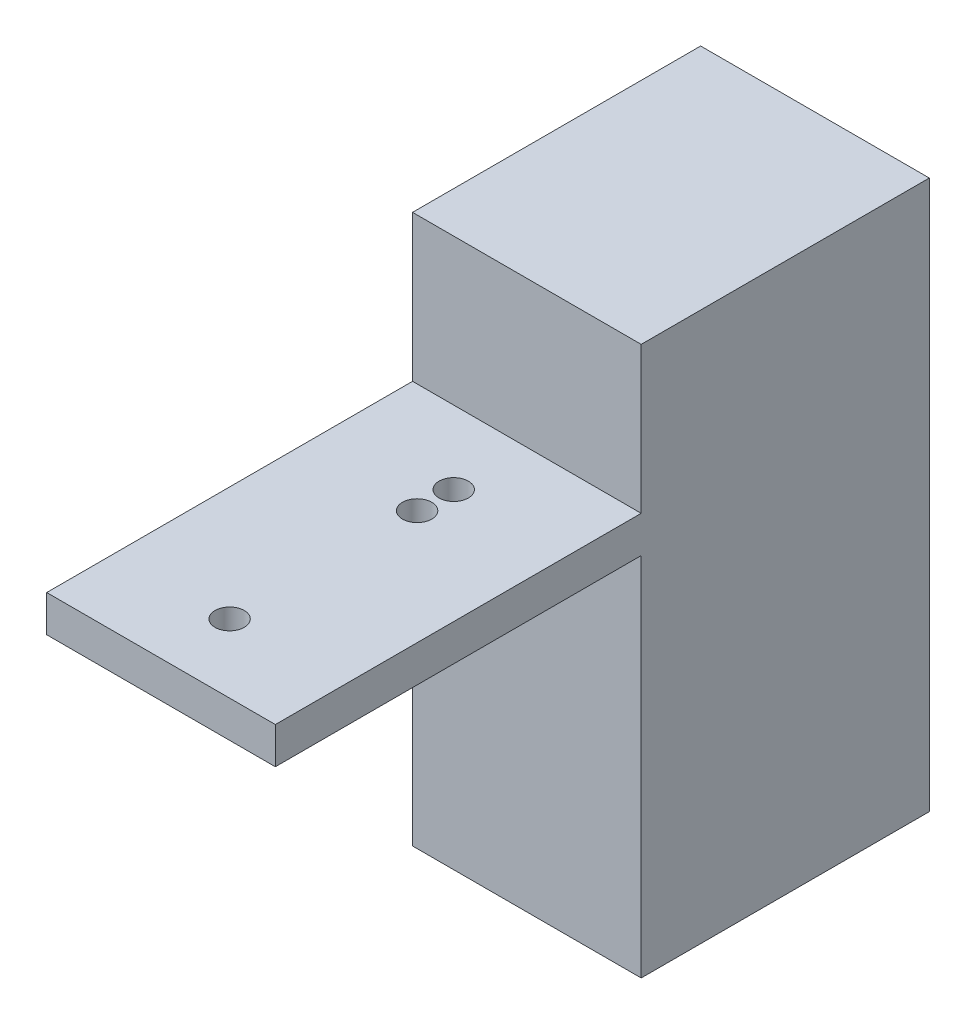
ISO-10303-21;
HEADER;
FILE_DESCRIPTION(('STEP AP214'),'2;1');
FILE_NAME('part.step','',(''),(''),'','','');
FILE_SCHEMA(('AUTOMOTIVE_DESIGN { 1 0 10303 214 1 1 1 1 }'));
ENDSEC;
DATA;
#1=APPLICATION_CONTEXT('core data for automotive mechanical design processes');
#2=APPLICATION_PROTOCOL_DEFINITION('international standard','automotive_design',2000,#1);
#3=PRODUCT_CONTEXT('',#1,'mechanical');
#4=PRODUCT('Part','Part','',(#3));
#5=PRODUCT_RELATED_PRODUCT_CATEGORY('part','',(#4));
#6=PRODUCT_DEFINITION_FORMATION('','',#4);
#7=PRODUCT_DEFINITION_CONTEXT('part definition',#1,'design');
#8=PRODUCT_DEFINITION('design','',#6,#7);
#9=PRODUCT_DEFINITION_SHAPE('','',#8);
#10=(LENGTH_UNIT() NAMED_UNIT(*) SI_UNIT(.MILLI.,.METRE.));
#11=(NAMED_UNIT(*) PLANE_ANGLE_UNIT() SI_UNIT($,.RADIAN.));
#12=(NAMED_UNIT(*) SI_UNIT($,.STERADIAN.) SOLID_ANGLE_UNIT());
#13=UNCERTAINTY_MEASURE_WITH_UNIT(LENGTH_MEASURE(1.E-05),#10,'distance_accuracy_value','');
#14=(GEOMETRIC_REPRESENTATION_CONTEXT(3) GLOBAL_UNCERTAINTY_ASSIGNED_CONTEXT((#13)) GLOBAL_UNIT_ASSIGNED_CONTEXT((#10,
#11,#12)) REPRESENTATION_CONTEXT('',''));
#15=CARTESIAN_POINT('',(0.,0.,0.));
#16=DIRECTION('',(0.,0.,1.));
#17=DIRECTION('',(1.,0.,0.));
#18=AXIS2_PLACEMENT_3D('',#15,#16,#17);
#19=CARTESIAN_POINT('',(12.5,0.,-31.5));
#20=DIRECTION('',(0.,0.,-1.));
#21=DIRECTION('',(0.,1.,0.));
#22=AXIS2_PLACEMENT_3D('',#19,#20,#21);
#23=PLANE('',#22);
#24=CARTESIAN_POINT('',(5.,-4.00000000000001,-31.5));
#25=DIRECTION('',(0.,0.,-1.));
#26=DIRECTION('',(0.,1.,0.));
#27=AXIS2_PLACEMENT_3D('',#24,#25,#26);
#28=CIRCLE('',#27,3.25);
#29=CARTESIAN_POINT('',(5.,-0.750000000000013,-31.5));
#30=VERTEX_POINT('',#29);
#31=EDGE_CURVE('E223',#30,#30,#28,.T.);
#32=ORIENTED_EDGE('',*,*,#31,.F.);
#33=EDGE_LOOP('',(#32));
#34=FACE_BOUND('',#33,.T.);
#35=CARTESIAN_POINT('',(-5.,-4.00000000000001,-31.5));
#36=DIRECTION('',(0.,0.,-1.));
#37=DIRECTION('',(0.,1.,0.));
#38=AXIS2_PLACEMENT_3D('',#35,#36,#37);
#39=CIRCLE('',#38,3.25);
#40=CARTESIAN_POINT('',(-5.,-0.750000000000013,-31.5));
#41=VERTEX_POINT('',#40);
#42=EDGE_CURVE('E234',#41,#41,#39,.T.);
#43=ORIENTED_EDGE('',*,*,#42,.F.);
#44=EDGE_LOOP('',(#43));
#45=FACE_BOUND('',#44,.T.);
#46=CARTESIAN_POINT('',(-5.,44.,-31.5));
#47=DIRECTION('',(0.,0.,-1.));
#48=DIRECTION('',(0.,1.,0.));
#49=AXIS2_PLACEMENT_3D('',#46,#47,#48);
#50=CIRCLE('',#49,3.25);
#51=CARTESIAN_POINT('',(-5.,47.25,-31.5));
#52=VERTEX_POINT('',#51);
#53=EDGE_CURVE('E329',#52,#52,#50,.T.);
#54=ORIENTED_EDGE('',*,*,#53,.F.);
#55=EDGE_LOOP('',(#54));
#56=FACE_BOUND('',#55,.T.);
#57=CARTESIAN_POINT('',(5.,44.,-31.5));
#58=DIRECTION('',(0.,0.,-1.));
#59=DIRECTION('',(0.,1.,0.));
#60=AXIS2_PLACEMENT_3D('',#57,#58,#59);
#61=CIRCLE('',#60,3.25);
#62=CARTESIAN_POINT('',(5.,47.25,-31.5));
#63=VERTEX_POINT('',#62);
#64=EDGE_CURVE('E243',#63,#63,#61,.T.);
#65=ORIENTED_EDGE('',*,*,#64,.F.);
#66=EDGE_LOOP('',(#65));
#67=FACE_BOUND('',#66,.T.);
#68=DIRECTION('',(1.,0.,0.));
#69=VECTOR('',#68,1.);
#70=CARTESIAN_POINT('',(12.5,40.015,-31.5));
#71=LINE('',#70,#69);
#72=CARTESIAN_POINT('',(-10.015,40.015,-31.5));
#73=VERTEX_POINT('',#72);
#74=CARTESIAN_POINT('',(10.015,40.015,-31.5));
#75=VERTEX_POINT('',#74);
#76=EDGE_CURVE('E11',#73,#75,#71,.T.);
#77=ORIENTED_EDGE('',*,*,#76,.F.);
#78=DIRECTION('',(0.,1.,0.));
#79=VECTOR('',#78,1.);
#80=CARTESIAN_POINT('',(-10.015,0.,-31.5));
#81=LINE('',#80,#79);
#82=CARTESIAN_POINT('',(-10.015,-0.015000000000007,-31.5));
#83=VERTEX_POINT('',#82);
#84=EDGE_CURVE('E50',#83,#73,#81,.T.);
#85=ORIENTED_EDGE('',*,*,#84,.F.);
#86=DIRECTION('',(1.,0.,0.));
#87=VECTOR('',#86,1.);
#88=CARTESIAN_POINT('',(12.5,-0.0150000000000098,-31.5));
#89=LINE('',#88,#87);
#90=CARTESIAN_POINT('',(10.015,-0.0150000000000095,-31.5));
#91=VERTEX_POINT('',#90);
#92=EDGE_CURVE('E205',#83,#91,#89,.T.);
#93=ORIENTED_EDGE('',*,*,#92,.T.);
#94=DIRECTION('',(0.,1.,0.));
#95=VECTOR('',#94,1.);
#96=CARTESIAN_POINT('',(10.015,0.,-31.5));
#97=LINE('',#96,#95);
#98=EDGE_CURVE('E201',#91,#75,#97,.T.);
#99=ORIENTED_EDGE('',*,*,#98,.T.);
#100=EDGE_LOOP('',(#77,#85,#93,#99));
#101=FACE_BOUND('',#100,.T.);
#102=DIRECTION('',(0.,-1.,0.));
#103=VECTOR('',#102,1.);
#104=CARTESIAN_POINT('',(-12.5,0.,-31.5));
#105=LINE('',#104,#103);
#106=CARTESIAN_POINT('',(-12.5,50.,-31.5));
#107=VERTEX_POINT('',#106);
#108=CARTESIAN_POINT('',(-12.5,-10.,-31.5));
#109=VERTEX_POINT('',#108);
#110=EDGE_CURVE('E154',#107,#109,#105,.T.);
#111=ORIENTED_EDGE('',*,*,#110,.F.);
#112=DIRECTION('',(-1.,0.,0.));
#113=VECTOR('',#112,1.);
#114=CARTESIAN_POINT('',(12.5,50.,-31.5));
#115=LINE('',#114,#113);
#116=CARTESIAN_POINT('',(12.5,50.,-31.5));
#117=VERTEX_POINT('',#116);
#118=EDGE_CURVE('E102',#117,#107,#115,.T.);
#119=ORIENTED_EDGE('',*,*,#118,.F.);
#120=DIRECTION('',(0.,-1.,0.));
#121=VECTOR('',#120,1.);
#122=CARTESIAN_POINT('',(12.5,0.,-31.5));
#123=LINE('',#122,#121);
#124=CARTESIAN_POINT('',(12.5,-10.,-31.5));
#125=VERTEX_POINT('',#124);
#126=EDGE_CURVE('E183',#117,#125,#123,.T.);
#127=ORIENTED_EDGE('',*,*,#126,.T.);
#128=DIRECTION('',(-1.,0.,0.));
#129=VECTOR('',#128,1.);
#130=CARTESIAN_POINT('',(12.5,-10.,-31.5));
#131=LINE('',#130,#129);
#132=EDGE_CURVE('E66',#125,#109,#131,.T.);
#133=ORIENTED_EDGE('',*,*,#132,.T.);
#134=EDGE_LOOP('',(#111,#119,#127,#133));
#135=FACE_BOUND('',#134,.T.);
#136=ADVANCED_FACE('F41',(#34,#45,#56,#67,#101,#135),#23,.T.);
#137=CARTESIAN_POINT('',(12.5,50.,0.));
#138=DIRECTION('',(0.,1.,0.));
#139=DIRECTION('',(0.,0.,1.));
#140=AXIS2_PLACEMENT_3D('',#137,#138,#139);
#141=PLANE('',#140);
#142=DIRECTION('',(0.,0.,-1.));
#143=VECTOR('',#142,1.);
#144=CARTESIAN_POINT('',(-12.5,50.,0.));
#145=LINE('',#144,#143);
#146=CARTESIAN_POINT('',(-12.5,50.,0.));
#147=VERTEX_POINT('',#146);
#148=EDGE_CURVE('E157',#147,#107,#145,.T.);
#149=ORIENTED_EDGE('',*,*,#148,.F.);
#150=DIRECTION('',(-1.,0.,0.));
#151=VECTOR('',#150,1.);
#152=CARTESIAN_POINT('',(12.5,50.,0.));
#153=LINE('',#152,#151);
#154=CARTESIAN_POINT('',(12.5,50.,0.));
#155=VERTEX_POINT('',#154);
#156=EDGE_CURVE('E196',#155,#147,#153,.T.);
#157=ORIENTED_EDGE('',*,*,#156,.F.);
#158=DIRECTION('',(0.,0.,-1.));
#159=VECTOR('',#158,1.);
#160=CARTESIAN_POINT('',(12.5,50.,0.));
#161=LINE('',#160,#159);
#162=EDGE_CURVE('E277',#155,#117,#161,.T.);
#163=ORIENTED_EDGE('',*,*,#162,.T.);
#164=ORIENTED_EDGE('',*,*,#118,.T.);
#165=EDGE_LOOP('',(#149,#157,#163,#164));
#166=FACE_BOUND('',#165,.T.);
#167=ADVANCED_FACE('F300',(#166),#141,.T.);
#168=CARTESIAN_POINT('',(12.5,0.,0.));
#169=DIRECTION('',(0.,0.,1.));
#170=DIRECTION('',(1.,0.,0.));
#171=AXIS2_PLACEMENT_3D('',#168,#169,#170);
#172=PLANE('',#171);
#173=DIRECTION('',(0.,1.,0.));
#174=VECTOR('',#173,1.);
#175=CARTESIAN_POINT('',(-12.5,0.,0.));
#176=LINE('',#175,#174);
#177=CARTESIAN_POINT('',(-12.5,34.,0.));
#178=VERTEX_POINT('',#177);
#179=EDGE_CURVE('E162',#178,#147,#176,.T.);
#180=ORIENTED_EDGE('',*,*,#179,.F.);
#181=DIRECTION('',(-1.,0.,0.));
#182=VECTOR('',#181,1.);
#183=CARTESIAN_POINT('',(12.5,34.,0.));
#184=LINE('',#183,#182);
#185=CARTESIAN_POINT('',(12.5,34.,0.));
#186=VERTEX_POINT('',#185);
#187=EDGE_CURVE('E193',#186,#178,#184,.T.);
#188=ORIENTED_EDGE('',*,*,#187,.F.);
#189=DIRECTION('',(0.,1.,0.));
#190=VECTOR('',#189,1.);
#191=CARTESIAN_POINT('',(12.5,0.,0.));
#192=LINE('',#191,#190);
#193=EDGE_CURVE('E281',#186,#155,#192,.T.);
#194=ORIENTED_EDGE('',*,*,#193,.T.);
#195=ORIENTED_EDGE('',*,*,#156,.T.);
#196=EDGE_LOOP('',(#180,#188,#194,#195));
#197=FACE_BOUND('',#196,.T.);
#198=ADVANCED_FACE('F303',(#197),#172,.T.);
#199=CARTESIAN_POINT('',(12.5,34.,0.));
#200=DIRECTION('',(0.,1.,0.));
#201=DIRECTION('',(0.,0.,1.));
#202=AXIS2_PLACEMENT_3D('',#199,#200,#201);
#203=PLANE('',#202);
#204=CARTESIAN_POINT('',(0.,34.,8.));
#205=DIRECTION('',(0.,1.,0.));
#206=DIRECTION('',(0.,0.,1.));
#207=AXIS2_PLACEMENT_3D('',#204,#205,#206);
#208=CIRCLE('',#207,1.6);
#209=CARTESIAN_POINT('',(0.,34.,9.6));
#210=VERTEX_POINT('',#209);
#211=EDGE_CURVE('E216',#210,#210,#208,.T.);
#212=ORIENTED_EDGE('',*,*,#211,.F.);
#213=EDGE_LOOP('',(#212));
#214=FACE_BOUND('',#213,.T.);
#215=CARTESIAN_POINT('',(0.,34.,12.));
#216=DIRECTION('',(0.,1.,0.));
#217=DIRECTION('',(0.,0.,1.));
#218=AXIS2_PLACEMENT_3D('',#215,#216,#217);
#219=CIRCLE('',#218,1.6);
#220=CARTESIAN_POINT('',(0.,34.,13.6));
#221=VERTEX_POINT('',#220);
#222=EDGE_CURVE('E500',#221,#221,#219,.T.);
#223=ORIENTED_EDGE('',*,*,#222,.F.);
#224=EDGE_LOOP('',(#223));
#225=FACE_BOUND('',#224,.T.);
#226=CARTESIAN_POINT('',(0.,34.,32.5));
#227=DIRECTION('',(0.,1.,0.));
#228=DIRECTION('',(0.,0.,1.));
#229=AXIS2_PLACEMENT_3D('',#226,#227,#228);
#230=CIRCLE('',#229,1.6);
#231=CARTESIAN_POINT('',(0.,34.,34.1));
#232=VERTEX_POINT('',#231);
#233=EDGE_CURVE('E504',#232,#232,#230,.T.);
#234=ORIENTED_EDGE('',*,*,#233,.F.);
#235=EDGE_LOOP('',(#234));
#236=FACE_BOUND('',#235,.T.);
#237=DIRECTION('',(0.,0.,-1.));
#238=VECTOR('',#237,1.);
#239=CARTESIAN_POINT('',(-12.5,34.,0.));
#240=LINE('',#239,#238);
#241=CARTESIAN_POINT('',(-12.5,34.,40.));
#242=VERTEX_POINT('',#241);
#243=EDGE_CURVE('E166',#242,#178,#240,.T.);
#244=ORIENTED_EDGE('',*,*,#243,.F.);
#245=DIRECTION('',(-1.,0.,0.));
#246=VECTOR('',#245,1.);
#247=CARTESIAN_POINT('',(12.5,34.,40.));
#248=LINE('',#247,#246);
#249=CARTESIAN_POINT('',(12.5,34.,40.));
#250=VERTEX_POINT('',#249);
#251=EDGE_CURVE('E190',#250,#242,#248,.T.);
#252=ORIENTED_EDGE('',*,*,#251,.F.);
#253=DIRECTION('',(0.,0.,-1.));
#254=VECTOR('',#253,1.);
#255=CARTESIAN_POINT('',(12.5,34.,0.));
#256=LINE('',#255,#254);
#257=EDGE_CURVE('E285',#250,#186,#256,.T.);
#258=ORIENTED_EDGE('',*,*,#257,.T.);
#259=ORIENTED_EDGE('',*,*,#187,.T.);
#260=EDGE_LOOP('',(#244,#252,#258,#259));
#261=FACE_BOUND('',#260,.T.);
#262=ADVANCED_FACE('F305',(#214,#225,#236,#261),#203,.T.);
#263=CARTESIAN_POINT('',(12.5,0.,40.));
#264=DIRECTION('',(0.,0.,1.));
#265=DIRECTION('',(1.,0.,0.));
#266=AXIS2_PLACEMENT_3D('',#263,#264,#265);
#267=PLANE('',#266);
#268=DIRECTION('',(0.,1.,0.));
#269=VECTOR('',#268,1.);
#270=CARTESIAN_POINT('',(-12.5,0.,40.));
#271=LINE('',#270,#269);
#272=CARTESIAN_POINT('',(-12.5,30.,40.));
#273=VERTEX_POINT('',#272);
#274=EDGE_CURVE('E170',#273,#242,#271,.T.);
#275=ORIENTED_EDGE('',*,*,#274,.F.);
#276=DIRECTION('',(-1.,0.,0.));
#277=VECTOR('',#276,1.);
#278=CARTESIAN_POINT('',(12.5,30.,40.));
#279=LINE('',#278,#277);
#280=CARTESIAN_POINT('',(12.5,30.,40.));
#281=VERTEX_POINT('',#280);
#282=EDGE_CURVE('E143',#281,#273,#279,.T.);
#283=ORIENTED_EDGE('',*,*,#282,.F.);
#284=DIRECTION('',(0.,1.,0.));
#285=VECTOR('',#284,1.);
#286=CARTESIAN_POINT('',(12.5,0.,40.));
#287=LINE('',#286,#285);
#288=EDGE_CURVE('E130',#281,#250,#287,.T.);
#289=ORIENTED_EDGE('',*,*,#288,.T.);
#290=ORIENTED_EDGE('',*,*,#251,.T.);
#291=EDGE_LOOP('',(#275,#283,#289,#290));
#292=FACE_BOUND('',#291,.T.);
#293=ADVANCED_FACE('F291',(#292),#267,.T.);
#294=CARTESIAN_POINT('',(12.5,30.,0.));
#295=DIRECTION('',(0.,1.,0.));
#296=DIRECTION('',(0.,0.,1.));
#297=AXIS2_PLACEMENT_3D('',#294,#295,#296);
#298=PLANE('',#297);
#299=CARTESIAN_POINT('',(0.,30.,8.));
#300=DIRECTION('',(0.,1.,0.));
#301=DIRECTION('',(0.,0.,1.));
#302=AXIS2_PLACEMENT_3D('',#299,#300,#301);
#303=CIRCLE('',#302,1.6);
#304=CARTESIAN_POINT('',(0.,30.,9.6));
#305=VERTEX_POINT('',#304);
#306=EDGE_CURVE('E44',#305,#305,#303,.T.);
#307=ORIENTED_EDGE('',*,*,#306,.T.);
#308=EDGE_LOOP('',(#307));
#309=FACE_BOUND('',#308,.T.);
#310=CARTESIAN_POINT('',(0.,30.,12.));
#311=DIRECTION('',(0.,1.,0.));
#312=DIRECTION('',(0.,0.,1.));
#313=AXIS2_PLACEMENT_3D('',#310,#311,#312);
#314=CIRCLE('',#313,1.6);
#315=CARTESIAN_POINT('',(0.,30.,13.6));
#316=VERTEX_POINT('',#315);
#317=EDGE_CURVE('E215',#316,#316,#314,.T.);
#318=ORIENTED_EDGE('',*,*,#317,.T.);
#319=EDGE_LOOP('',(#318));
#320=FACE_BOUND('',#319,.T.);
#321=CARTESIAN_POINT('',(0.,30.,32.5));
#322=DIRECTION('',(0.,1.,0.));
#323=DIRECTION('',(0.,0.,1.));
#324=AXIS2_PLACEMENT_3D('',#321,#322,#323);
#325=CIRCLE('',#324,1.6);
#326=CARTESIAN_POINT('',(0.,30.,34.1));
#327=VERTEX_POINT('',#326);
#328=EDGE_CURVE('E212',#327,#327,#325,.T.);
#329=ORIENTED_EDGE('',*,*,#328,.T.);
#330=EDGE_LOOP('',(#329));
#331=FACE_BOUND('',#330,.T.);
#332=DIRECTION('',(0.,0.,-1.));
#333=VECTOR('',#332,1.);
#334=CARTESIAN_POINT('',(-12.5,30.,0.));
#335=LINE('',#334,#333);
#336=CARTESIAN_POINT('',(-12.5,30.,0.));
#337=VERTEX_POINT('',#336);
#338=EDGE_CURVE('E138',#273,#337,#335,.T.);
#339=ORIENTED_EDGE('',*,*,#338,.T.);
#340=DIRECTION('',(-1.,0.,0.));
#341=VECTOR('',#340,1.);
#342=CARTESIAN_POINT('',(12.5,30.,0.));
#343=LINE('',#342,#341);
#344=CARTESIAN_POINT('',(12.5,30.,0.));
#345=VERTEX_POINT('',#344);
#346=EDGE_CURVE('E135',#345,#337,#343,.T.);
#347=ORIENTED_EDGE('',*,*,#346,.F.);
#348=DIRECTION('',(0.,0.,-1.));
#349=VECTOR('',#348,1.);
#350=CARTESIAN_POINT('',(12.5,30.,0.));
#351=LINE('',#350,#349);
#352=EDGE_CURVE('E122',#281,#345,#351,.T.);
#353=ORIENTED_EDGE('',*,*,#352,.F.);
#354=ORIENTED_EDGE('',*,*,#282,.T.);
#355=EDGE_LOOP('',(#339,#347,#353,#354));
#356=FACE_BOUND('',#355,.T.);
#357=ADVANCED_FACE('F136',(#309,#320,#331,#356),#298,.F.);
#358=CARTESIAN_POINT('',(12.5,0.,0.));
#359=DIRECTION('',(0.,0.,1.));
#360=DIRECTION('',(1.,0.,0.));
#361=AXIS2_PLACEMENT_3D('',#358,#359,#360);
#362=PLANE('',#361);
#363=DIRECTION('',(0.,1.,0.));
#364=VECTOR('',#363,1.);
#365=CARTESIAN_POINT('',(-12.5,0.,0.));
#366=LINE('',#365,#364);
#367=CARTESIAN_POINT('',(-12.5,-10.,0.));
#368=VERTEX_POINT('',#367);
#369=EDGE_CURVE('E176',#368,#337,#366,.T.);
#370=ORIENTED_EDGE('',*,*,#369,.F.);
#371=DIRECTION('',(-1.,0.,0.));
#372=VECTOR('',#371,1.);
#373=CARTESIAN_POINT('',(12.5,-10.,0.));
#374=LINE('',#373,#372);
#375=CARTESIAN_POINT('',(12.5,-10.,0.));
#376=VERTEX_POINT('',#375);
#377=EDGE_CURVE('E144',#376,#368,#374,.T.);
#378=ORIENTED_EDGE('',*,*,#377,.F.);
#379=DIRECTION('',(0.,1.,0.));
#380=VECTOR('',#379,1.);
#381=CARTESIAN_POINT('',(12.5,0.,0.));
#382=LINE('',#381,#380);
#383=EDGE_CURVE('E127',#376,#345,#382,.T.);
#384=ORIENTED_EDGE('',*,*,#383,.T.);
#385=ORIENTED_EDGE('',*,*,#346,.T.);
#386=EDGE_LOOP('',(#370,#378,#384,#385));
#387=FACE_BOUND('',#386,.T.);
#388=ADVANCED_FACE('F146',(#387),#362,.T.);
#389=CARTESIAN_POINT('',(12.5,-10.,0.));
#390=DIRECTION('',(0.,-1.,0.));
#391=DIRECTION('',(0.,0.,-1.));
#392=AXIS2_PLACEMENT_3D('',#389,#390,#391);
#393=PLANE('',#392);
#394=DIRECTION('',(0.,0.,1.));
#395=VECTOR('',#394,1.);
#396=CARTESIAN_POINT('',(-12.5,-10.,0.));
#397=LINE('',#396,#395);
#398=EDGE_CURVE('E179',#109,#368,#397,.T.);
#399=ORIENTED_EDGE('',*,*,#398,.F.);
#400=ORIENTED_EDGE('',*,*,#132,.F.);
#401=DIRECTION('',(0.,0.,1.));
#402=VECTOR('',#401,1.);
#403=CARTESIAN_POINT('',(12.5,-10.,0.));
#404=LINE('',#403,#402);
#405=EDGE_CURVE('E148',#125,#376,#404,.T.);
#406=ORIENTED_EDGE('',*,*,#405,.T.);
#407=ORIENTED_EDGE('',*,*,#377,.T.);
#408=EDGE_LOOP('',(#399,#400,#406,#407));
#409=FACE_BOUND('',#408,.T.);
#410=ADVANCED_FACE('F295',(#409),#393,.T.);
#411=CARTESIAN_POINT('',(12.5,0.,0.));
#412=DIRECTION('',(1.,0.,0.));
#413=DIRECTION('',(0.,0.,-1.));
#414=AXIS2_PLACEMENT_3D('',#411,#412,#413);
#415=PLANE('',#414);
#416=ORIENTED_EDGE('',*,*,#126,.F.);
#417=ORIENTED_EDGE('',*,*,#162,.F.);
#418=ORIENTED_EDGE('',*,*,#193,.F.);
#419=ORIENTED_EDGE('',*,*,#257,.F.);
#420=ORIENTED_EDGE('',*,*,#288,.F.);
#421=ORIENTED_EDGE('',*,*,#352,.T.);
#422=ORIENTED_EDGE('',*,*,#383,.F.);
#423=ORIENTED_EDGE('',*,*,#405,.F.);
#424=EDGE_LOOP('',(#416,#417,#418,#419,#420,#421,#422,#423));
#425=FACE_BOUND('',#424,.T.);
#426=ADVANCED_FACE('F124',(#425),#415,.T.);
#427=CARTESIAN_POINT('',(-12.5,0.,0.));
#428=DIRECTION('',(1.,0.,0.));
#429=DIRECTION('',(0.,0.,-1.));
#430=AXIS2_PLACEMENT_3D('',#427,#428,#429);
#431=PLANE('',#430);
#432=ORIENTED_EDGE('',*,*,#110,.T.);
#433=ORIENTED_EDGE('',*,*,#398,.T.);
#434=ORIENTED_EDGE('',*,*,#369,.T.);
#435=ORIENTED_EDGE('',*,*,#338,.F.);
#436=ORIENTED_EDGE('',*,*,#274,.T.);
#437=ORIENTED_EDGE('',*,*,#243,.T.);
#438=ORIENTED_EDGE('',*,*,#179,.T.);
#439=ORIENTED_EDGE('',*,*,#148,.T.);
#440=EDGE_LOOP('',(#432,#433,#434,#435,#436,#437,#438,#439));
#441=FACE_BOUND('',#440,.T.);
#442=ADVANCED_FACE('F294',(#441),#431,.F.);
#443=CARTESIAN_POINT('',(0.,40.015,-17.735));
#444=DIRECTION('',(0.,1.,0.));
#445=DIRECTION('',(0.,0.,1.));
#446=AXIS2_PLACEMENT_3D('',#443,#444,#445);
#447=PLANE('',#446);
#448=ORIENTED_EDGE('',*,*,#76,.T.);
#449=DIRECTION('',(0.,0.,-1.));
#450=VECTOR('',#449,1.);
#451=CARTESIAN_POINT('',(10.015,40.015,-17.735));
#452=LINE('',#451,#450);
#453=CARTESIAN_POINT('',(10.015,40.015,-17.735));
#454=VERTEX_POINT('',#453);
#455=EDGE_CURVE('E58',#454,#75,#452,.T.);
#456=ORIENTED_EDGE('',*,*,#455,.F.);
#457=DIRECTION('',(1.,0.,0.));
#458=VECTOR('',#457,1.);
#459=CARTESIAN_POINT('',(0.,40.015,-17.735));
#460=LINE('',#459,#458);
#461=CARTESIAN_POINT('',(-10.015,40.015,-17.735));
#462=VERTEX_POINT('',#461);
#463=EDGE_CURVE('E242',#462,#454,#460,.T.);
#464=ORIENTED_EDGE('',*,*,#463,.F.);
#465=DIRECTION('',(0.,0.,-1.));
#466=VECTOR('',#465,1.);
#467=CARTESIAN_POINT('',(-10.015,40.015,-17.735));
#468=LINE('',#467,#466);
#469=EDGE_CURVE('E158',#462,#73,#468,.T.);
#470=ORIENTED_EDGE('',*,*,#469,.T.);
#471=EDGE_LOOP('',(#448,#456,#464,#470));
#472=FACE_BOUND('',#471,.T.);
#473=ADVANCED_FACE('F336',(#472),#447,.F.);
#474=CARTESIAN_POINT('',(-10.015,0.,-17.735));
#475=DIRECTION('',(-1.,0.,0.));
#476=DIRECTION('',(0.,0.,1.));
#477=AXIS2_PLACEMENT_3D('',#474,#475,#476);
#478=PLANE('',#477);
#479=ORIENTED_EDGE('',*,*,#84,.T.);
#480=ORIENTED_EDGE('',*,*,#469,.F.);
#481=DIRECTION('',(0.,1.,0.));
#482=VECTOR('',#481,1.);
#483=CARTESIAN_POINT('',(-10.015,0.,-17.735));
#484=LINE('',#483,#482);
#485=CARTESIAN_POINT('',(-10.015,-0.0150000000000118,-17.735));
#486=VERTEX_POINT('',#485);
#487=EDGE_CURVE('E258',#486,#462,#484,.T.);
#488=ORIENTED_EDGE('',*,*,#487,.F.);
#489=DIRECTION('',(0.,0.,-1.));
#490=VECTOR('',#489,1.);
#491=CARTESIAN_POINT('',(-10.015,-0.0150000000000118,-17.735));
#492=LINE('',#491,#490);
#493=EDGE_CURVE('E265',#486,#83,#492,.T.);
#494=ORIENTED_EDGE('',*,*,#493,.T.);
#495=EDGE_LOOP('',(#479,#480,#488,#494));
#496=FACE_BOUND('',#495,.T.);
#497=ADVANCED_FACE('F343',(#496),#478,.F.);
#498=CARTESIAN_POINT('',(0.,-0.015000000000013,-17.735));
#499=DIRECTION('',(0.,1.,0.));
#500=DIRECTION('',(0.,0.,1.));
#501=AXIS2_PLACEMENT_3D('',#498,#499,#500);
#502=PLANE('',#501);
#503=ORIENTED_EDGE('',*,*,#493,.F.);
#504=DIRECTION('',(1.,0.,0.));
#505=VECTOR('',#504,1.);
#506=CARTESIAN_POINT('',(0.,-0.015000000000013,-17.735));
#507=LINE('',#506,#505);
#508=CARTESIAN_POINT('',(10.015,-0.0150000000000143,-17.735));
#509=VERTEX_POINT('',#508);
#510=EDGE_CURVE('E254',#486,#509,#507,.T.);
#511=ORIENTED_EDGE('',*,*,#510,.T.);
#512=DIRECTION('',(0.,0.,-1.));
#513=VECTOR('',#512,1.);
#514=CARTESIAN_POINT('',(10.015,-0.0150000000000143,-17.735));
#515=LINE('',#514,#513);
#516=EDGE_CURVE('E269',#509,#91,#515,.T.);
#517=ORIENTED_EDGE('',*,*,#516,.T.);
#518=ORIENTED_EDGE('',*,*,#92,.F.);
#519=EDGE_LOOP('',(#503,#511,#517,#518));
#520=FACE_BOUND('',#519,.T.);
#521=ADVANCED_FACE('F354',(#520),#502,.T.);
#522=CARTESIAN_POINT('',(10.015,0.,-17.735));
#523=DIRECTION('',(-1.,0.,0.));
#524=DIRECTION('',(0.,0.,1.));
#525=AXIS2_PLACEMENT_3D('',#522,#523,#524);
#526=PLANE('',#525);
#527=ORIENTED_EDGE('',*,*,#516,.F.);
#528=DIRECTION('',(0.,1.,0.));
#529=VECTOR('',#528,1.);
#530=CARTESIAN_POINT('',(10.015,0.,-17.735));
#531=LINE('',#530,#529);
#532=EDGE_CURVE('E251',#509,#454,#531,.T.);
#533=ORIENTED_EDGE('',*,*,#532,.T.);
#534=ORIENTED_EDGE('',*,*,#455,.T.);
#535=ORIENTED_EDGE('',*,*,#98,.F.);
#536=EDGE_LOOP('',(#527,#533,#534,#535));
#537=FACE_BOUND('',#536,.T.);
#538=ADVANCED_FACE('F358',(#537),#526,.T.);
#539=CARTESIAN_POINT('',(0.,0.,-17.735));
#540=DIRECTION('',(0.,0.,-1.));
#541=DIRECTION('',(0.,1.,0.));
#542=AXIS2_PLACEMENT_3D('',#539,#540,#541);
#543=PLANE('',#542);
#544=ORIENTED_EDGE('',*,*,#463,.T.);
#545=ORIENTED_EDGE('',*,*,#532,.F.);
#546=ORIENTED_EDGE('',*,*,#510,.F.);
#547=ORIENTED_EDGE('',*,*,#487,.T.);
#548=EDGE_LOOP('',(#544,#545,#546,#547));
#549=FACE_BOUND('',#548,.T.);
#550=ADVANCED_FACE('F360',(#549),#543,.T.);
#551=CARTESIAN_POINT('',(5.,44.,-19.5));
#552=DIRECTION('',(0.,0.,-1.));
#553=DIRECTION('',(0.,1.,0.));
#554=AXIS2_PLACEMENT_3D('',#551,#552,#553);
#555=CYLINDRICAL_SURFACE('',#554,3.25);
#556=CARTESIAN_POINT('',(5.,44.,-19.5));
#557=DIRECTION('',(0.,0.,-1.));
#558=DIRECTION('',(0.,1.,0.));
#559=AXIS2_PLACEMENT_3D('',#556,#557,#558);
#560=CIRCLE('',#559,3.25);
#561=CARTESIAN_POINT('',(5.,47.25,-19.5));
#562=VERTEX_POINT('',#561);
#563=EDGE_CURVE('E238',#562,#562,#560,.T.);
#564=ORIENTED_EDGE('',*,*,#563,.F.);
#565=EDGE_LOOP('',(#564));
#566=FACE_BOUND('',#565,.T.);
#567=ORIENTED_EDGE('',*,*,#64,.T.);
#568=EDGE_LOOP('',(#567));
#569=FACE_BOUND('',#568,.T.);
#570=ADVANCED_FACE('F363',(#566,#569),#555,.F.);
#571=CARTESIAN_POINT('',(5.,44.,-19.5));
#572=DIRECTION('',(0.,0.,-1.));
#573=DIRECTION('',(0.,1.,0.));
#574=AXIS2_PLACEMENT_3D('',#571,#572,#573);
#575=PLANE('',#574);
#576=ORIENTED_EDGE('',*,*,#563,.T.);
#577=EDGE_LOOP('',(#576));
#578=FACE_BOUND('',#577,.T.);
#579=ADVANCED_FACE('F369',(#578),#575,.T.);
#580=CARTESIAN_POINT('',(-5.,44.,-19.5));
#581=DIRECTION('',(0.,0.,-1.));
#582=DIRECTION('',(0.,1.,0.));
#583=AXIS2_PLACEMENT_3D('',#580,#581,#582);
#584=CYLINDRICAL_SURFACE('',#583,3.25);
#585=CARTESIAN_POINT('',(-5.,44.,-19.5));
#586=DIRECTION('',(0.,0.,-1.));
#587=DIRECTION('',(0.,1.,0.));
#588=AXIS2_PLACEMENT_3D('',#585,#586,#587);
#589=CIRCLE('',#588,3.25);
#590=CARTESIAN_POINT('',(-5.,47.25,-19.5));
#591=VERTEX_POINT('',#590);
#592=EDGE_CURVE('E247',#591,#591,#589,.T.);
#593=ORIENTED_EDGE('',*,*,#592,.F.);
#594=EDGE_LOOP('',(#593));
#595=FACE_BOUND('',#594,.T.);
#596=ORIENTED_EDGE('',*,*,#53,.T.);
#597=EDGE_LOOP('',(#596));
#598=FACE_BOUND('',#597,.T.);
#599=ADVANCED_FACE('F418',(#595,#598),#584,.F.);
#600=CARTESIAN_POINT('',(-5.,44.,-19.5));
#601=DIRECTION('',(0.,0.,-1.));
#602=DIRECTION('',(0.,1.,0.));
#603=AXIS2_PLACEMENT_3D('',#600,#601,#602);
#604=PLANE('',#603);
#605=ORIENTED_EDGE('',*,*,#592,.T.);
#606=EDGE_LOOP('',(#605));
#607=FACE_BOUND('',#606,.T.);
#608=ADVANCED_FACE('F414',(#607),#604,.T.);
#609=CARTESIAN_POINT('',(-5.,-4.00000000000001,-19.5));
#610=DIRECTION('',(0.,0.,-1.));
#611=DIRECTION('',(0.,1.,0.));
#612=AXIS2_PLACEMENT_3D('',#609,#610,#611);
#613=CYLINDRICAL_SURFACE('',#612,3.25);
#614=CARTESIAN_POINT('',(-5.,-4.00000000000001,-19.5));
#615=DIRECTION('',(0.,0.,-1.));
#616=DIRECTION('',(0.,1.,0.));
#617=AXIS2_PLACEMENT_3D('',#614,#615,#616);
#618=CIRCLE('',#617,3.25);
#619=CARTESIAN_POINT('',(-5.,-0.750000000000011,-19.5));
#620=VERTEX_POINT('',#619);
#621=EDGE_CURVE('E514',#620,#620,#618,.T.);
#622=ORIENTED_EDGE('',*,*,#621,.F.);
#623=EDGE_LOOP('',(#622));
#624=FACE_BOUND('',#623,.T.);
#625=ORIENTED_EDGE('',*,*,#42,.T.);
#626=EDGE_LOOP('',(#625));
#627=FACE_BOUND('',#626,.T.);
#628=ADVANCED_FACE('F417',(#624,#627),#613,.F.);
#629=CARTESIAN_POINT('',(-5.,-4.00000000000001,-19.5));
#630=DIRECTION('',(0.,0.,-1.));
#631=DIRECTION('',(0.,1.,0.));
#632=AXIS2_PLACEMENT_3D('',#629,#630,#631);
#633=PLANE('',#632);
#634=ORIENTED_EDGE('',*,*,#621,.T.);
#635=EDGE_LOOP('',(#634));
#636=FACE_BOUND('',#635,.T.);
#637=ADVANCED_FACE('F423',(#636),#633,.T.);
#638=CARTESIAN_POINT('',(5.,-4.00000000000001,-19.5));
#639=DIRECTION('',(0.,0.,-1.));
#640=DIRECTION('',(0.,1.,0.));
#641=AXIS2_PLACEMENT_3D('',#638,#639,#640);
#642=CYLINDRICAL_SURFACE('',#641,3.25);
#643=CARTESIAN_POINT('',(5.,-4.00000000000001,-19.5));
#644=DIRECTION('',(0.,0.,-1.));
#645=DIRECTION('',(0.,1.,0.));
#646=AXIS2_PLACEMENT_3D('',#643,#644,#645);
#647=CIRCLE('',#646,3.25);
#648=CARTESIAN_POINT('',(5.,-0.750000000000011,-19.5));
#649=VERTEX_POINT('',#648);
#650=EDGE_CURVE('E228',#649,#649,#647,.T.);
#651=ORIENTED_EDGE('',*,*,#650,.F.);
#652=EDGE_LOOP('',(#651));
#653=FACE_BOUND('',#652,.T.);
#654=ORIENTED_EDGE('',*,*,#31,.T.);
#655=EDGE_LOOP('',(#654));
#656=FACE_BOUND('',#655,.T.);
#657=ADVANCED_FACE('F408',(#653,#656),#642,.F.);
#658=CARTESIAN_POINT('',(5.,-4.00000000000001,-19.5));
#659=DIRECTION('',(0.,0.,-1.));
#660=DIRECTION('',(0.,1.,0.));
#661=AXIS2_PLACEMENT_3D('',#658,#659,#660);
#662=PLANE('',#661);
#663=ORIENTED_EDGE('',*,*,#650,.T.);
#664=EDGE_LOOP('',(#663));
#665=FACE_BOUND('',#664,.T.);
#666=ADVANCED_FACE('F398',(#665),#662,.T.);
#667=CARTESIAN_POINT('',(0.,-9.99999999999999,32.5));
#668=DIRECTION('',(0.,1.,0.));
#669=DIRECTION('',(0.,0.,1.));
#670=AXIS2_PLACEMENT_3D('',#667,#668,#669);
#671=CYLINDRICAL_SURFACE('',#670,1.6);
#672=ORIENTED_EDGE('',*,*,#233,.T.);
#673=EDGE_LOOP('',(#672));
#674=FACE_BOUND('',#673,.T.);
#675=ORIENTED_EDGE('',*,*,#328,.F.);
#676=EDGE_LOOP('',(#675));
#677=FACE_BOUND('',#676,.T.);
#678=ADVANCED_FACE('F395',(#674,#677),#671,.F.);
#679=CARTESIAN_POINT('',(0.,-9.99999999999999,12.));
#680=DIRECTION('',(0.,1.,0.));
#681=DIRECTION('',(0.,0.,1.));
#682=AXIS2_PLACEMENT_3D('',#679,#680,#681);
#683=CYLINDRICAL_SURFACE('',#682,1.6);
#684=ORIENTED_EDGE('',*,*,#222,.T.);
#685=EDGE_LOOP('',(#684));
#686=FACE_BOUND('',#685,.T.);
#687=ORIENTED_EDGE('',*,*,#317,.F.);
#688=EDGE_LOOP('',(#687));
#689=FACE_BOUND('',#688,.T.);
#690=ADVANCED_FACE('F397',(#686,#689),#683,.F.);
#691=CARTESIAN_POINT('',(0.,-9.99999999999999,8.));
#692=DIRECTION('',(0.,1.,0.));
#693=DIRECTION('',(0.,0.,1.));
#694=AXIS2_PLACEMENT_3D('',#691,#692,#693);
#695=CYLINDRICAL_SURFACE('',#694,1.6);
#696=ORIENTED_EDGE('',*,*,#211,.T.);
#697=EDGE_LOOP('',(#696));
#698=FACE_BOUND('',#697,.T.);
#699=ORIENTED_EDGE('',*,*,#306,.F.);
#700=EDGE_LOOP('',(#699));
#701=FACE_BOUND('',#700,.T.);
#702=ADVANCED_FACE('F405',(#698,#701),#695,.F.);
#703=CLOSED_SHELL('',(#136,#167,#198,#262,#293,#357,#388,#410,#426,#442,#473,#497,#521,#538,
#550,#570,#579,#599,#608,#628,#637,#657,#666,#678,#690,#702));
#704=MANIFOLD_SOLID_BREP('B2',#703);
#705=ADVANCED_BREP_SHAPE_REPRESENTATION('',(#18,#704),#14);
#706=SHAPE_DEFINITION_REPRESENTATION(#9,#705);
ENDSEC;
END-ISO-10303-21;
